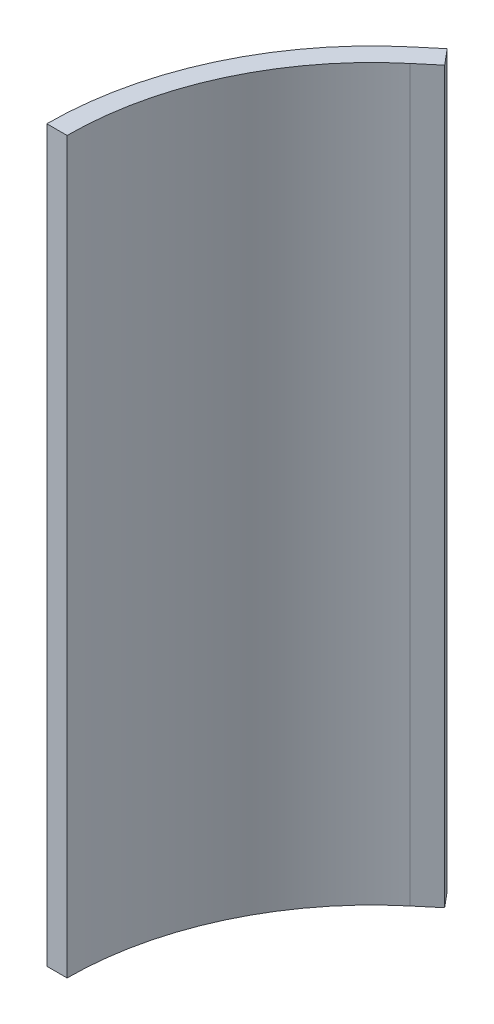
ISO-10303-21;
HEADER;
FILE_DESCRIPTION(('STEP AP214'),'2;1');
FILE_NAME('part.step','',(''),(''),'','','');
FILE_SCHEMA(('AUTOMOTIVE_DESIGN { 1 0 10303 214 1 1 1 1 }'));
ENDSEC;
DATA;
#1=APPLICATION_CONTEXT('core data for automotive mechanical design processes');
#2=APPLICATION_PROTOCOL_DEFINITION('international standard','automotive_design',2000,#1);
#3=PRODUCT_CONTEXT('',#1,'mechanical');
#4=PRODUCT('Part','Part','',(#3));
#5=PRODUCT_RELATED_PRODUCT_CATEGORY('part','',(#4));
#6=PRODUCT_DEFINITION_FORMATION('','',#4);
#7=PRODUCT_DEFINITION_CONTEXT('part definition',#1,'design');
#8=PRODUCT_DEFINITION('design','',#6,#7);
#9=PRODUCT_DEFINITION_SHAPE('','',#8);
#10=(LENGTH_UNIT() NAMED_UNIT(*) SI_UNIT(.MILLI.,.METRE.));
#11=(NAMED_UNIT(*) PLANE_ANGLE_UNIT() SI_UNIT($,.RADIAN.));
#12=(NAMED_UNIT(*) SI_UNIT($,.STERADIAN.) SOLID_ANGLE_UNIT());
#13=UNCERTAINTY_MEASURE_WITH_UNIT(LENGTH_MEASURE(1.E-05),#10,'distance_accuracy_value','');
#14=(GEOMETRIC_REPRESENTATION_CONTEXT(3) GLOBAL_UNCERTAINTY_ASSIGNED_CONTEXT((#13)) GLOBAL_UNIT_ASSIGNED_CONTEXT((#10,
#11,#12)) REPRESENTATION_CONTEXT('',''));
#15=CARTESIAN_POINT('',(0.,0.,0.));
#16=DIRECTION('',(0.,0.,1.));
#17=DIRECTION('',(1.,0.,0.));
#18=AXIS2_PLACEMENT_3D('',#15,#16,#17);
#19=CARTESIAN_POINT('',(18.3464398654779,200.,-65.4116710658726));
#20=DIRECTION('',(-0.766044443118983,0.,0.642787609686533));
#21=DIRECTION('',(0.642787609686533,0.,0.766044443118983));
#22=AXIS2_PLACEMENT_3D('',#19,#20,#21);
#23=PLANE('',#22);
#24=DIRECTION('',(-0.642787609686533,0.,-0.766044443118983));
#25=VECTOR('',#24,1.);
#26=CARTESIAN_POINT('',(18.3464398654779,20.,-65.4116710658726));
#27=LINE('',#26,#25);
#28=CARTESIAN_POINT('',(21.5603779139106,20.,-61.5814488502777));
#29=VERTEX_POINT('',#28);
#30=CARTESIAN_POINT('',(18.3464398654779,20.,-65.4116710658726));
#31=VERTEX_POINT('',#30);
#32=EDGE_CURVE('E117',#29,#31,#27,.T.);
#33=ORIENTED_EDGE('',*,*,#32,.T.);
#34=DIRECTION('',(0.,-1.,0.));
#35=VECTOR('',#34,1.);
#36=CARTESIAN_POINT('',(18.3464398654779,200.,-65.4116710658726));
#37=LINE('',#36,#35);
#38=CARTESIAN_POINT('',(18.3464398654779,200.,-65.4116710658726));
#39=VERTEX_POINT('',#38);
#40=EDGE_CURVE('E11',#39,#31,#37,.T.);
#41=ORIENTED_EDGE('',*,*,#40,.F.);
#42=DIRECTION('',(-0.642787609686533,0.,-0.766044443118983));
#43=VECTOR('',#42,1.);
#44=CARTESIAN_POINT('',(18.3464398654779,200.,-65.4116710658726));
#45=LINE('',#44,#43);
#46=CARTESIAN_POINT('',(21.5603779139106,200.,-61.5814488502777));
#47=VERTEX_POINT('',#46);
#48=EDGE_CURVE('E127',#47,#39,#45,.T.);
#49=ORIENTED_EDGE('',*,*,#48,.F.);
#50=DIRECTION('',(0.,-1.,0.));
#51=VECTOR('',#50,1.);
#52=CARTESIAN_POINT('',(21.5603779139106,200.,-61.5814488502777));
#53=LINE('',#52,#51);
#54=EDGE_CURVE('E113',#47,#29,#53,.T.);
#55=ORIENTED_EDGE('',*,*,#54,.T.);
#56=EDGE_LOOP('',(#33,#41,#49,#55));
#57=FACE_BOUND('',#56,.T.);
#58=ADVANCED_FACE('F33',(#57),#23,.F.);
#59=CARTESIAN_POINT('',(18.3464398654779,200.,-65.4116710658726));
#60=DIRECTION('',(0.642787609686534,0.,0.766044443118983));
#61=DIRECTION('',(0.766044443118983,0.,-0.642787609686534));
#62=AXIS2_PLACEMENT_3D('',#59,#60,#61);
#63=PLANE('',#62);
#64=DIRECTION('',(-0.766044443118983,0.,0.642787609686534));
#65=VECTOR('',#64,1.);
#66=CARTESIAN_POINT('',(18.3464398654779,20.,-65.4116710658726));
#67=LINE('',#66,#65);
#68=CARTESIAN_POINT('',(13.6735687624521,20.,-61.4906666467847));
#69=VERTEX_POINT('',#68);
#70=EDGE_CURVE('E120',#31,#69,#67,.T.);
#71=ORIENTED_EDGE('',*,*,#70,.T.);
#72=DIRECTION('',(0.,-1.,0.));
#73=VECTOR('',#72,1.);
#74=CARTESIAN_POINT('',(13.6735687624521,200.,-61.4906666467847));
#75=LINE('',#74,#73);
#76=CARTESIAN_POINT('',(13.6735687624521,200.,-61.4906666467847));
#77=VERTEX_POINT('',#76);
#78=EDGE_CURVE('E41',#77,#69,#75,.T.);
#79=ORIENTED_EDGE('',*,*,#78,.F.);
#80=DIRECTION('',(-0.766044443118983,0.,0.642787609686534));
#81=VECTOR('',#80,1.);
#82=CARTESIAN_POINT('',(18.3464398654779,200.,-65.4116710658726));
#83=LINE('',#82,#81);
#84=EDGE_CURVE('E86',#39,#77,#83,.T.);
#85=ORIENTED_EDGE('',*,*,#84,.F.);
#86=ORIENTED_EDGE('',*,*,#40,.T.);
#87=EDGE_LOOP('',(#71,#79,#85,#86));
#88=FACE_BOUND('',#87,.T.);
#89=ADVANCED_FACE('F151',(#88),#63,.F.);
#90=CARTESIAN_POINT('',(65.2703644666136,200.,0.));
#91=DIRECTION('',(0.,-1.,0.));
#92=DIRECTION('',(0.,0.,-1.));
#93=AXIS2_PLACEMENT_3D('',#90,#91,#92);
#94=CYLINDRICAL_SURFACE('',#93,80.2703644666136);
#95=CARTESIAN_POINT('',(65.2703644666136,20.,0.));
#96=DIRECTION('',(0.,1.,0.));
#97=DIRECTION('',(0.,0.,1.));
#98=AXIS2_PLACEMENT_3D('',#95,#96,#97);
#99=CIRCLE('',#98,80.2703644666136);
#100=CARTESIAN_POINT('',(-15.,20.,0.));
#101=VERTEX_POINT('',#100);
#102=EDGE_CURVE('E122',#69,#101,#99,.T.);
#103=ORIENTED_EDGE('',*,*,#102,.T.);
#104=DIRECTION('',(0.,-1.,0.));
#105=VECTOR('',#104,1.);
#106=CARTESIAN_POINT('',(-15.,200.,0.));
#107=LINE('',#106,#105);
#108=CARTESIAN_POINT('',(-15.,200.,0.));
#109=VERTEX_POINT('',#108);
#110=EDGE_CURVE('E108',#109,#101,#107,.T.);
#111=ORIENTED_EDGE('',*,*,#110,.F.);
#112=CARTESIAN_POINT('',(65.2703644666136,200.,0.));
#113=DIRECTION('',(0.,1.,0.));
#114=DIRECTION('',(0.,0.,1.));
#115=AXIS2_PLACEMENT_3D('',#112,#113,#114);
#116=CIRCLE('',#115,80.2703644666136);
#117=EDGE_CURVE('E99',#77,#109,#116,.T.);
#118=ORIENTED_EDGE('',*,*,#117,.F.);
#119=ORIENTED_EDGE('',*,*,#78,.T.);
#120=EDGE_LOOP('',(#103,#111,#118,#119));
#121=FACE_BOUND('',#120,.T.);
#122=ADVANCED_FACE('F133',(#121),#94,.T.);
#123=CARTESIAN_POINT('',(-15.,200.,0.));
#124=DIRECTION('',(0.,0.,-1.));
#125=DIRECTION('',(-1.,0.,0.));
#126=AXIS2_PLACEMENT_3D('',#123,#124,#125);
#127=PLANE('',#126);
#128=DIRECTION('',(1.,0.,0.));
#129=VECTOR('',#128,1.);
#130=CARTESIAN_POINT('',(-15.,20.,0.));
#131=LINE('',#130,#129);
#132=CARTESIAN_POINT('',(-9.99999999999999,20.,0.));
#133=VERTEX_POINT('',#132);
#134=EDGE_CURVE('E107',#101,#133,#131,.T.);
#135=ORIENTED_EDGE('',*,*,#134,.T.);
#136=DIRECTION('',(0.,-1.,0.));
#137=VECTOR('',#136,1.);
#138=CARTESIAN_POINT('',(-9.99999999999999,200.,0.));
#139=LINE('',#138,#137);
#140=CARTESIAN_POINT('',(-9.99999999999999,200.,0.));
#141=VERTEX_POINT('',#140);
#142=EDGE_CURVE('E104',#141,#133,#139,.T.);
#143=ORIENTED_EDGE('',*,*,#142,.F.);
#144=DIRECTION('',(1.,0.,0.));
#145=VECTOR('',#144,1.);
#146=CARTESIAN_POINT('',(-15.,200.,0.));
#147=LINE('',#146,#145);
#148=EDGE_CURVE('E93',#109,#141,#147,.T.);
#149=ORIENTED_EDGE('',*,*,#148,.F.);
#150=ORIENTED_EDGE('',*,*,#110,.T.);
#151=EDGE_LOOP('',(#135,#143,#149,#150));
#152=FACE_BOUND('',#151,.T.);
#153=ADVANCED_FACE('F105',(#152),#127,.F.);
#154=CARTESIAN_POINT('',(65.2703644666136,200.,0.));
#155=DIRECTION('',(0.,-1.,0.));
#156=DIRECTION('',(0.,0.,-1.));
#157=AXIS2_PLACEMENT_3D('',#154,#155,#156);
#158=CYLINDRICAL_SURFACE('',#157,75.2703644666136);
#159=CARTESIAN_POINT('',(65.2703644666136,20.,0.));
#160=DIRECTION('',(0.,-1.,0.));
#161=DIRECTION('',(0.,0.,1.));
#162=AXIS2_PLACEMENT_3D('',#159,#160,#161);
#163=CIRCLE('',#162,75.2703644666136);
#164=CARTESIAN_POINT('',(16.8875068108848,20.,-57.6604444311898));
#165=VERTEX_POINT('',#164);
#166=EDGE_CURVE('E72',#133,#165,#163,.T.);
#167=ORIENTED_EDGE('',*,*,#166,.T.);
#168=DIRECTION('',(0.,-1.,0.));
#169=VECTOR('',#168,1.);
#170=CARTESIAN_POINT('',(16.8875068108848,200.,-57.6604444311898));
#171=LINE('',#170,#169);
#172=CARTESIAN_POINT('',(16.8875068108848,200.,-57.6604444311898));
#173=VERTEX_POINT('',#172);
#174=EDGE_CURVE('E109',#173,#165,#171,.T.);
#175=ORIENTED_EDGE('',*,*,#174,.F.);
#176=CARTESIAN_POINT('',(65.2703644666136,200.,0.));
#177=DIRECTION('',(0.,-1.,0.));
#178=DIRECTION('',(0.,0.,1.));
#179=AXIS2_PLACEMENT_3D('',#176,#177,#178);
#180=CIRCLE('',#179,75.2703644666136);
#181=EDGE_CURVE('E97',#141,#173,#180,.T.);
#182=ORIENTED_EDGE('',*,*,#181,.F.);
#183=ORIENTED_EDGE('',*,*,#142,.T.);
#184=EDGE_LOOP('',(#167,#175,#182,#183));
#185=FACE_BOUND('',#184,.T.);
#186=ADVANCED_FACE('F111',(#185),#158,.F.);
#187=CARTESIAN_POINT('',(21.5603779139106,200.,-61.5814488502777));
#188=DIRECTION('',(-0.642787609686533,0.,-0.766044443118983));
#189=DIRECTION('',(-0.766044443118983,0.,0.642787609686533));
#190=AXIS2_PLACEMENT_3D('',#187,#188,#189);
#191=PLANE('',#190);
#192=DIRECTION('',(0.766044443118983,0.,-0.642787609686533));
#193=VECTOR('',#192,1.);
#194=CARTESIAN_POINT('',(21.5603779139106,20.,-61.5814488502777));
#195=LINE('',#194,#193);
#196=EDGE_CURVE('E78',#165,#29,#195,.T.);
#197=ORIENTED_EDGE('',*,*,#196,.T.);
#198=ORIENTED_EDGE('',*,*,#54,.F.);
#199=DIRECTION('',(0.766044443118983,0.,-0.642787609686533));
#200=VECTOR('',#199,1.);
#201=CARTESIAN_POINT('',(21.5603779139106,200.,-61.5814488502777));
#202=LINE('',#201,#200);
#203=EDGE_CURVE('E49',#173,#47,#202,.T.);
#204=ORIENTED_EDGE('',*,*,#203,.F.);
#205=ORIENTED_EDGE('',*,*,#174,.T.);
#206=EDGE_LOOP('',(#197,#198,#204,#205));
#207=FACE_BOUND('',#206,.T.);
#208=ADVANCED_FACE('F140',(#207),#191,.F.);
#209=CARTESIAN_POINT('',(65.2703644666136,200.,0.));
#210=DIRECTION('',(0.,1.,0.));
#211=DIRECTION('',(0.,0.,1.));
#212=AXIS2_PLACEMENT_3D('',#209,#210,#211);
#213=PLANE('',#212);
#214=ORIENTED_EDGE('',*,*,#48,.T.);
#215=ORIENTED_EDGE('',*,*,#84,.T.);
#216=ORIENTED_EDGE('',*,*,#117,.T.);
#217=ORIENTED_EDGE('',*,*,#148,.T.);
#218=ORIENTED_EDGE('',*,*,#181,.T.);
#219=ORIENTED_EDGE('',*,*,#203,.T.);
#220=EDGE_LOOP('',(#214,#215,#216,#217,#218,#219));
#221=FACE_BOUND('',#220,.T.);
#222=ADVANCED_FACE('F95',(#221),#213,.T.);
#223=CARTESIAN_POINT('',(65.2703644666136,20.,0.));
#224=DIRECTION('',(0.,1.,0.));
#225=DIRECTION('',(0.,0.,1.));
#226=AXIS2_PLACEMENT_3D('',#223,#224,#225);
#227=PLANE('',#226);
#228=ORIENTED_EDGE('',*,*,#32,.F.);
#229=ORIENTED_EDGE('',*,*,#196,.F.);
#230=ORIENTED_EDGE('',*,*,#166,.F.);
#231=ORIENTED_EDGE('',*,*,#134,.F.);
#232=ORIENTED_EDGE('',*,*,#102,.F.);
#233=ORIENTED_EDGE('',*,*,#70,.F.);
#234=EDGE_LOOP('',(#228,#229,#230,#231,#232,#233));
#235=FACE_BOUND('',#234,.T.);
#236=ADVANCED_FACE('F136',(#235),#227,.F.);
#237=CLOSED_SHELL('',(#58,#89,#122,#153,#186,#208,#222,#236));
#238=MANIFOLD_SOLID_BREP('B2',#237);
#239=ADVANCED_BREP_SHAPE_REPRESENTATION('',(#18,#238),#14);
#240=SHAPE_DEFINITION_REPRESENTATION(#9,#239);
ENDSEC;
END-ISO-10303-21;
